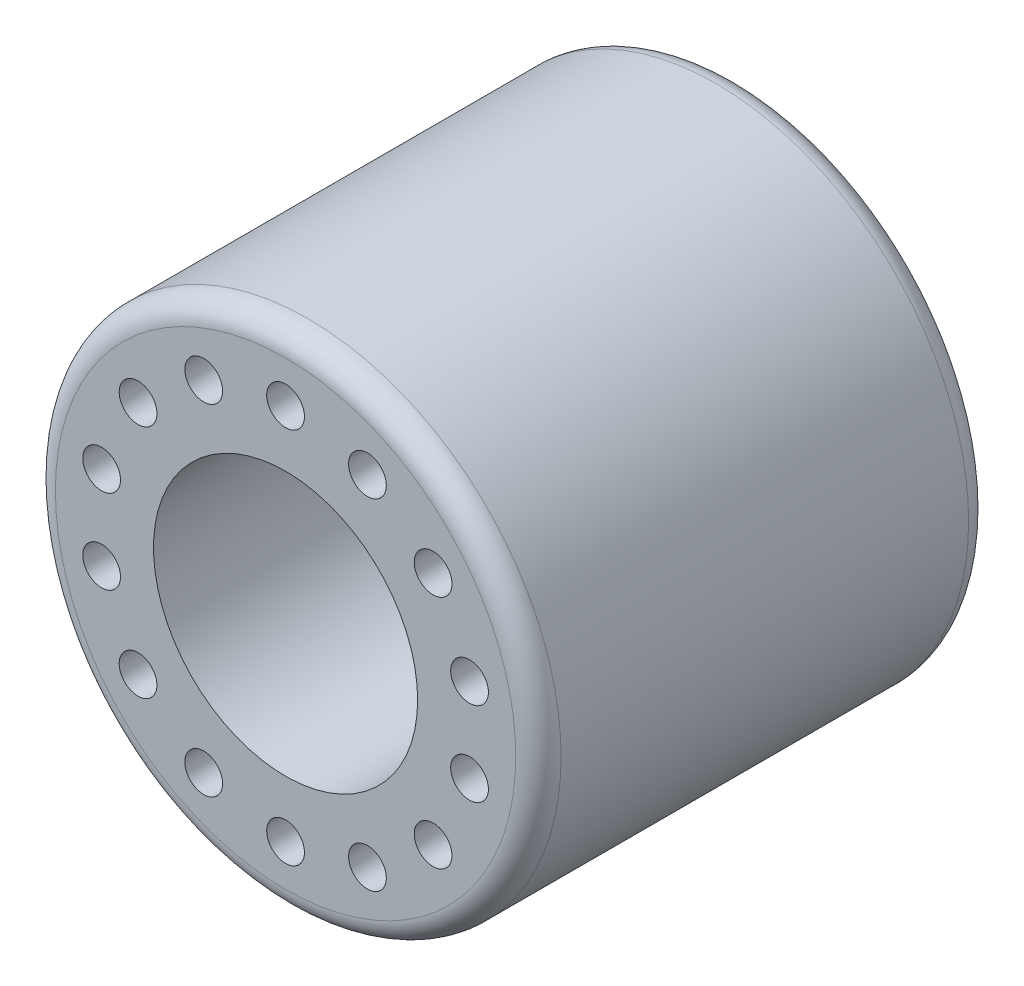
ISO-10303-21;
HEADER;
FILE_DESCRIPTION(('STEP AP214'),'2;1');
FILE_NAME('part.step','',(''),(''),'','','');
FILE_SCHEMA(('AUTOMOTIVE_DESIGN { 1 0 10303 214 1 1 1 1 }'));
ENDSEC;
DATA;
#1=APPLICATION_CONTEXT('core data for automotive mechanical design processes');
#2=APPLICATION_PROTOCOL_DEFINITION('international standard','automotive_design',2000,#1);
#3=PRODUCT_CONTEXT('',#1,'mechanical');
#4=PRODUCT('Part','Part','',(#3));
#5=PRODUCT_RELATED_PRODUCT_CATEGORY('part','',(#4));
#6=PRODUCT_DEFINITION_FORMATION('','',#4);
#7=PRODUCT_DEFINITION_CONTEXT('part definition',#1,'design');
#8=PRODUCT_DEFINITION('design','',#6,#7);
#9=PRODUCT_DEFINITION_SHAPE('','',#8);
#10=(LENGTH_UNIT() NAMED_UNIT(*) SI_UNIT(.MILLI.,.METRE.));
#11=(NAMED_UNIT(*) PLANE_ANGLE_UNIT() SI_UNIT($,.RADIAN.));
#12=(NAMED_UNIT(*) SI_UNIT($,.STERADIAN.) SOLID_ANGLE_UNIT());
#13=UNCERTAINTY_MEASURE_WITH_UNIT(LENGTH_MEASURE(1.E-05),#10,'distance_accuracy_value','');
#14=(GEOMETRIC_REPRESENTATION_CONTEXT(3) GLOBAL_UNCERTAINTY_ASSIGNED_CONTEXT((#13)) GLOBAL_UNIT_ASSIGNED_CONTEXT((#10,
#11,#12)) REPRESENTATION_CONTEXT('',''));
#15=CARTESIAN_POINT('',(0.,0.,0.));
#16=DIRECTION('',(0.,0.,1.));
#17=DIRECTION('',(1.,0.,0.));
#18=AXIS2_PLACEMENT_3D('',#15,#16,#17);
#19=CARTESIAN_POINT('',(0.,0.,15.24));
#20=DIRECTION('',(0.,0.,1.));
#21=DIRECTION('',(1.,0.,0.));
#22=AXIS2_PLACEMENT_3D('',#19,#20,#21);
#23=PLANE('',#22);
#24=CARTESIAN_POINT('',(2.7551617433966,5.72115231118083,15.24));
#25=DIRECTION('',(0.,0.,1.));
#26=DIRECTION('',(1.,0.,0.));
#27=AXIS2_PLACEMENT_3D('',#24,#25,#26);
#28=CIRCLE('',#27,0.634999999999972);
#29=CARTESIAN_POINT('',(3.39016174339657,5.72115231118083,15.24));
#30=VERTEX_POINT('',#29);
#31=EDGE_CURVE('E109',#30,#30,#28,.T.);
#32=ORIENTED_EDGE('',*,*,#31,.F.);
#33=EDGE_LOOP('',(#32));
#34=FACE_BOUND('',#33,.T.);
#35=CARTESIAN_POINT('',(4.9646299136724,3.9591602418038,15.24));
#36=DIRECTION('',(0.,0.,1.));
#37=DIRECTION('',(1.,0.,0.));
#38=AXIS2_PLACEMENT_3D('',#35,#36,#37);
#39=CIRCLE('',#38,0.635000000000155);
#40=CARTESIAN_POINT('',(5.59962991367255,3.9591602418038,15.24));
#41=VERTEX_POINT('',#40);
#42=EDGE_CURVE('E103',#41,#41,#39,.T.);
#43=ORIENTED_EDGE('',*,*,#42,.F.);
#44=EDGE_LOOP('',(#43));
#45=FACE_BOUND('',#44,.T.);
#46=CARTESIAN_POINT('',(6.19079224235542,1.41300793062365,15.24));
#47=DIRECTION('',(0.,0.,1.));
#48=DIRECTION('',(1.,0.,0.));
#49=AXIS2_PLACEMENT_3D('',#46,#47,#48);
#50=CIRCLE('',#49,0.635000000000515);
#51=CARTESIAN_POINT('',(6.82579224235593,1.41300793062365,15.24));
#52=VERTEX_POINT('',#51);
#53=EDGE_CURVE('E97',#52,#52,#50,.T.);
#54=ORIENTED_EDGE('',*,*,#53,.F.);
#55=EDGE_LOOP('',(#54));
#56=FACE_BOUND('',#55,.T.);
#57=CARTESIAN_POINT('',(6.1907922423559,-1.41300793062154,15.24));
#58=DIRECTION('',(0.,0.,1.));
#59=DIRECTION('',(1.,0.,0.));
#60=AXIS2_PLACEMENT_3D('',#57,#58,#59);
#61=CIRCLE('',#60,0.63500000000098);
#62=CARTESIAN_POINT('',(6.82579224235688,-1.41300793062154,15.24));
#63=VERTEX_POINT('',#62);
#64=EDGE_CURVE('E91',#63,#63,#61,.T.);
#65=ORIENTED_EDGE('',*,*,#64,.F.);
#66=EDGE_LOOP('',(#65));
#67=FACE_BOUND('',#66,.T.);
#68=CARTESIAN_POINT('',(4.96462991367375,-3.95916024180211,15.24));
#69=DIRECTION('',(0.,0.,1.));
#70=DIRECTION('',(1.,0.,0.));
#71=AXIS2_PLACEMENT_3D('',#68,#69,#70);
#72=CIRCLE('',#71,0.635000000001461);
#73=CARTESIAN_POINT('',(5.59962991367521,-3.95916024180211,15.24));
#74=VERTEX_POINT('',#73);
#75=EDGE_CURVE('E85',#74,#74,#72,.T.);
#76=ORIENTED_EDGE('',*,*,#75,.F.);
#77=EDGE_LOOP('',(#76));
#78=FACE_BOUND('',#77,.T.);
#79=CARTESIAN_POINT('',(2.75516174339855,-5.72115231117989,15.24));
#80=DIRECTION('',(0.,0.,1.));
#81=DIRECTION('',(1.,0.,0.));
#82=AXIS2_PLACEMENT_3D('',#79,#80,#81);
#83=CIRCLE('',#82,0.635000000001867);
#84=CARTESIAN_POINT('',(3.39016174340042,-5.72115231117989,15.24));
#85=VERTEX_POINT('',#84);
#86=EDGE_CURVE('E79',#85,#85,#83,.T.);
#87=ORIENTED_EDGE('',*,*,#86,.F.);
#88=EDGE_LOOP('',(#87));
#89=FACE_BOUND('',#88,.T.);
#90=CARTESIAN_POINT('',(2.16340130644441E-12,-6.35,15.24));
#91=DIRECTION('',(0.,0.,1.));
#92=DIRECTION('',(1.,0.,0.));
#93=AXIS2_PLACEMENT_3D('',#90,#91,#92);
#94=CIRCLE('',#93,0.635000000002112);
#95=CARTESIAN_POINT('',(0.635000000004275,-6.35,15.24));
#96=VERTEX_POINT('',#95);
#97=EDGE_CURVE('E73',#96,#96,#94,.T.);
#98=ORIENTED_EDGE('',*,*,#97,.F.);
#99=EDGE_LOOP('',(#98));
#100=FACE_BOUND('',#99,.T.);
#101=CARTESIAN_POINT('',(-2.75516174339444,-5.72115231118083,15.24));
#102=DIRECTION('',(0.,0.,1.));
#103=DIRECTION('',(1.,0.,0.));
#104=AXIS2_PLACEMENT_3D('',#101,#102,#103);
#105=CIRCLE('',#104,0.635000000002152);
#106=CARTESIAN_POINT('',(-2.12016174339229,-5.72115231118083,15.24));
#107=VERTEX_POINT('',#106);
#108=EDGE_CURVE('E66',#107,#107,#105,.T.);
#109=ORIENTED_EDGE('',*,*,#108,.F.);
#110=EDGE_LOOP('',(#109));
#111=FACE_BOUND('',#110,.T.);
#112=CARTESIAN_POINT('',(-4.96462991367023,-3.9591602418038,15.24));
#113=DIRECTION('',(0.,0.,1.));
#114=DIRECTION('',(1.,0.,0.));
#115=AXIS2_PLACEMENT_3D('',#112,#113,#114);
#116=CIRCLE('',#115,0.635000000001981);
#117=CARTESIAN_POINT('',(-4.32962991366825,-3.9591602418038,15.24));
#118=VERTEX_POINT('',#117);
#119=EDGE_CURVE('E138',#118,#118,#116,.T.);
#120=ORIENTED_EDGE('',*,*,#119,.F.);
#121=EDGE_LOOP('',(#120));
#122=FACE_BOUND('',#121,.T.);
#123=CARTESIAN_POINT('',(-6.19079224235326,-1.41300793062365,15.24));
#124=DIRECTION('',(0.,0.,1.));
#125=DIRECTION('',(1.,0.,0.));
#126=AXIS2_PLACEMENT_3D('',#123,#124,#125);
#127=CIRCLE('',#126,0.635000000001633);
#128=CARTESIAN_POINT('',(-5.55579224235162,-1.41300793062365,15.24));
#129=VERTEX_POINT('',#128);
#130=EDGE_CURVE('E132',#129,#129,#127,.T.);
#131=ORIENTED_EDGE('',*,*,#130,.F.);
#132=EDGE_LOOP('',(#131));
#133=FACE_BOUND('',#132,.T.);
#134=CARTESIAN_POINT('',(-6.19079224235374,1.41300793062154,15.24));
#135=DIRECTION('',(0.,0.,1.));
#136=DIRECTION('',(1.,0.,0.));
#137=AXIS2_PLACEMENT_3D('',#134,#135,#136);
#138=CIRCLE('',#137,0.635000000001178);
#139=CARTESIAN_POINT('',(-5.55579224235256,1.41300793062154,15.24));
#140=VERTEX_POINT('',#139);
#141=EDGE_CURVE('E126',#140,#140,#138,.T.);
#142=ORIENTED_EDGE('',*,*,#141,.F.);
#143=EDGE_LOOP('',(#142));
#144=FACE_BOUND('',#143,.T.);
#145=CARTESIAN_POINT('',(-4.96462991367158,3.95916024180211,15.24));
#146=DIRECTION('',(0.,0.,1.));
#147=DIRECTION('',(1.,0.,0.));
#148=AXIS2_PLACEMENT_3D('',#145,#146,#147);
#149=CIRCLE('',#148,0.635000000000714);
#150=CARTESIAN_POINT('',(-4.32962991367087,3.95916024180211,15.24));
#151=VERTEX_POINT('',#150);
#152=EDGE_CURVE('E120',#151,#151,#149,.T.);
#153=ORIENTED_EDGE('',*,*,#152,.F.);
#154=EDGE_LOOP('',(#153));
#155=FACE_BOUND('',#154,.T.);
#156=CARTESIAN_POINT('',(-2.75516174339639,5.72115231117989,15.24));
#157=DIRECTION('',(0.,0.,1.));
#158=DIRECTION('',(1.,0.,0.));
#159=AXIS2_PLACEMENT_3D('',#156,#157,#158);
#160=CIRCLE('',#159,0.635000000000322);
#161=CARTESIAN_POINT('',(-2.12016174339607,5.72115231117989,15.24));
#162=VERTEX_POINT('',#161);
#163=EDGE_CURVE('E114',#162,#162,#160,.T.);
#164=ORIENTED_EDGE('',*,*,#163,.F.);
#165=EDGE_LOOP('',(#164));
#166=FACE_BOUND('',#165,.T.);
#167=CARTESIAN_POINT('',(0.,6.35,15.24));
#168=DIRECTION('',(0.,0.,1.));
#169=DIRECTION('',(1.,0.,0.));
#170=AXIS2_PLACEMENT_3D('',#167,#168,#169);
#171=CIRCLE('',#170,0.635);
#172=CARTESIAN_POINT('',(0.635,6.35,15.24));
#173=VERTEX_POINT('',#172);
#174=EDGE_CURVE('E60',#173,#173,#171,.T.);
#175=ORIENTED_EDGE('',*,*,#174,.F.);
#176=EDGE_LOOP('',(#175));
#177=FACE_BOUND('',#176,.T.);
#178=CARTESIAN_POINT('',(0.,0.,15.24));
#179=DIRECTION('',(0.,0.,1.));
#180=DIRECTION('',(1.,0.,0.));
#181=AXIS2_PLACEMENT_3D('',#178,#179,#180);
#182=CIRCLE('',#181,7.747);
#183=CARTESIAN_POINT('',(7.747,0.,15.24));
#184=VERTEX_POINT('',#183);
#185=EDGE_CURVE('E10',#184,#184,#182,.T.);
#186=ORIENTED_EDGE('',*,*,#185,.T.);
#187=EDGE_LOOP('',(#186));
#188=FACE_BOUND('',#187,.T.);
#189=CARTESIAN_POINT('',(0.,0.,15.24));
#190=DIRECTION('',(0.,0.,1.));
#191=DIRECTION('',(1.,0.,0.));
#192=AXIS2_PLACEMENT_3D('',#189,#190,#191);
#193=CIRCLE('',#192,4.445);
#194=CARTESIAN_POINT('',(4.445,0.,15.24));
#195=VERTEX_POINT('',#194);
#196=EDGE_CURVE('E53',#195,#195,#193,.T.);
#197=ORIENTED_EDGE('',*,*,#196,.F.);
#198=EDGE_LOOP('',(#197));
#199=FACE_BOUND('',#198,.T.);
#200=ADVANCED_FACE('F33',(#34,#45,#56,#67,#78,#89,#100,#111,#122,#133,#144,#155,#166,#177,#188,
#199),#23,.T.);
#201=CARTESIAN_POINT('',(0.,0.,0.));
#202=DIRECTION('',(0.,0.,1.));
#203=DIRECTION('',(1.,0.,0.));
#204=AXIS2_PLACEMENT_3D('',#201,#202,#203);
#205=PLANE('',#204);
#206=CARTESIAN_POINT('',(0.,0.,0.));
#207=DIRECTION('',(0.,0.,1.));
#208=DIRECTION('',(1.,0.,0.));
#209=AXIS2_PLACEMENT_3D('',#206,#207,#208);
#210=CIRCLE('',#209,7.747);
#211=CARTESIAN_POINT('',(7.747,0.,0.));
#212=VERTEX_POINT('',#211);
#213=EDGE_CURVE('E40',#212,#212,#210,.F.);
#214=ORIENTED_EDGE('',*,*,#213,.T.);
#215=EDGE_LOOP('',(#214));
#216=FACE_BOUND('',#215,.T.);
#217=CARTESIAN_POINT('',(0.,0.,0.));
#218=DIRECTION('',(0.,0.,1.));
#219=DIRECTION('',(1.,0.,0.));
#220=AXIS2_PLACEMENT_3D('',#217,#218,#219);
#221=CIRCLE('',#220,4.445);
#222=CARTESIAN_POINT('',(4.445,0.,0.));
#223=VERTEX_POINT('',#222);
#224=EDGE_CURVE('E54',#223,#223,#221,.T.);
#225=ORIENTED_EDGE('',*,*,#224,.T.);
#226=EDGE_LOOP('',(#225));
#227=FACE_BOUND('',#226,.T.);
#228=ADVANCED_FACE('F155',(#216,#227),#205,.F.);
#229=CARTESIAN_POINT('',(0.,0.,15.24));
#230=DIRECTION('',(0.,0.,-1.));
#231=DIRECTION('',(-1.,0.,0.));
#232=AXIS2_PLACEMENT_3D('',#229,#230,#231);
#233=CYLINDRICAL_SURFACE('',#232,8.509);
#234=CARTESIAN_POINT('',(0.,0.,0.762000000000001));
#235=DIRECTION('',(0.,0.,1.));
#236=DIRECTION('',(1.,0.,0.));
#237=AXIS2_PLACEMENT_3D('',#234,#235,#236);
#238=CIRCLE('',#237,8.509);
#239=CARTESIAN_POINT('',(8.509,0.,0.762000000000001));
#240=VERTEX_POINT('',#239);
#241=EDGE_CURVE('E44',#240,#240,#238,.T.);
#242=ORIENTED_EDGE('',*,*,#241,.T.);
#243=EDGE_LOOP('',(#242));
#244=FACE_BOUND('',#243,.T.);
#245=CARTESIAN_POINT('',(0.,0.,14.478));
#246=DIRECTION('',(0.,0.,1.));
#247=DIRECTION('',(1.,0.,0.));
#248=AXIS2_PLACEMENT_3D('',#245,#246,#247);
#249=CIRCLE('',#248,8.509);
#250=CARTESIAN_POINT('',(8.509,0.,14.478));
#251=VERTEX_POINT('',#250);
#252=EDGE_CURVE('E48',#251,#251,#249,.F.);
#253=ORIENTED_EDGE('',*,*,#252,.T.);
#254=EDGE_LOOP('',(#253));
#255=FACE_BOUND('',#254,.T.);
#256=ADVANCED_FACE('F174',(#244,#255),#233,.T.);
#257=CARTESIAN_POINT('',(0.,0.,15.24));
#258=DIRECTION('',(0.,0.,-1.));
#259=DIRECTION('',(-1.,0.,0.));
#260=AXIS2_PLACEMENT_3D('',#257,#258,#259);
#261=CYLINDRICAL_SURFACE('',#260,4.445);
#262=ORIENTED_EDGE('',*,*,#196,.T.);
#263=EDGE_LOOP('',(#262));
#264=FACE_BOUND('',#263,.T.);
#265=ORIENTED_EDGE('',*,*,#224,.F.);
#266=EDGE_LOOP('',(#265));
#267=FACE_BOUND('',#266,.T.);
#268=ADVANCED_FACE('F170',(#264,#267),#261,.F.);
#269=CARTESIAN_POINT('',(0.,0.,0.762000000000001));
#270=DIRECTION('',(0.,0.,1.));
#271=DIRECTION('',(1.,0.,0.));
#272=AXIS2_PLACEMENT_3D('',#269,#270,#271);
#273=TOROIDAL_SURFACE('',#272,7.747,0.762);
#274=ORIENTED_EDGE('',*,*,#213,.F.);
#275=EDGE_LOOP('',(#274));
#276=FACE_BOUND('',#275,.T.);
#277=ORIENTED_EDGE('',*,*,#241,.F.);
#278=EDGE_LOOP('',(#277));
#279=FACE_BOUND('',#278,.T.);
#280=ADVANCED_FACE('F173',(#276,#279),#273,.T.);
#281=CARTESIAN_POINT('',(0.,0.,14.478));
#282=DIRECTION('',(0.,0.,1.));
#283=DIRECTION('',(1.,0.,0.));
#284=AXIS2_PLACEMENT_3D('',#281,#282,#283);
#285=TOROIDAL_SURFACE('',#284,7.747,0.762);
#286=ORIENTED_EDGE('',*,*,#252,.F.);
#287=EDGE_LOOP('',(#286));
#288=FACE_BOUND('',#287,.T.);
#289=ORIENTED_EDGE('',*,*,#185,.F.);
#290=EDGE_LOOP('',(#289));
#291=FACE_BOUND('',#290,.T.);
#292=ADVANCED_FACE('F35',(#288,#291),#285,.T.);
#293=CARTESIAN_POINT('',(0.,6.35,13.97));
#294=DIRECTION('',(0.,0.,1.));
#295=DIRECTION('',(1.,0.,0.));
#296=AXIS2_PLACEMENT_3D('',#293,#294,#295);
#297=CYLINDRICAL_SURFACE('',#296,0.635);
#298=CARTESIAN_POINT('',(0.,6.35,13.97));
#299=DIRECTION('',(0.,0.,1.));
#300=DIRECTION('',(1.,0.,0.));
#301=AXIS2_PLACEMENT_3D('',#298,#299,#300);
#302=CIRCLE('',#301,0.635);
#303=CARTESIAN_POINT('',(0.635,6.35,13.97));
#304=VERTEX_POINT('',#303);
#305=EDGE_CURVE('E57',#304,#304,#302,.T.);
#306=ORIENTED_EDGE('',*,*,#305,.F.);
#307=EDGE_LOOP('',(#306));
#308=FACE_BOUND('',#307,.T.);
#309=ORIENTED_EDGE('',*,*,#174,.T.);
#310=EDGE_LOOP('',(#309));
#311=FACE_BOUND('',#310,.T.);
#312=ADVANCED_FACE('F191',(#308,#311),#297,.F.);
#313=CARTESIAN_POINT('',(0.,6.35,13.97));
#314=DIRECTION('',(0.,0.,1.));
#315=DIRECTION('',(1.,0.,0.));
#316=AXIS2_PLACEMENT_3D('',#313,#314,#315);
#317=PLANE('',#316);
#318=ORIENTED_EDGE('',*,*,#305,.T.);
#319=EDGE_LOOP('',(#318));
#320=FACE_BOUND('',#319,.T.);
#321=ADVANCED_FACE('F201',(#320),#317,.T.);
#322=CARTESIAN_POINT('',(-2.75516174339639,5.72115231117989,13.97));
#323=DIRECTION('',(0.,0.,1.));
#324=DIRECTION('',(1.,0.,0.));
#325=AXIS2_PLACEMENT_3D('',#322,#323,#324);
#326=CYLINDRICAL_SURFACE('',#325,0.635000000000322);
#327=CARTESIAN_POINT('',(-2.75516174339639,5.72115231117989,13.97));
#328=DIRECTION('',(0.,0.,1.));
#329=DIRECTION('',(1.,0.,0.));
#330=AXIS2_PLACEMENT_3D('',#327,#328,#329);
#331=CIRCLE('',#330,0.635000000000322);
#332=CARTESIAN_POINT('',(-2.12016174339607,5.72115231117989,13.97));
#333=VERTEX_POINT('',#332);
#334=EDGE_CURVE('E117',#333,#333,#331,.T.);
#335=ORIENTED_EDGE('',*,*,#334,.F.);
#336=EDGE_LOOP('',(#335));
#337=FACE_BOUND('',#336,.T.);
#338=ORIENTED_EDGE('',*,*,#163,.T.);
#339=EDGE_LOOP('',(#338));
#340=FACE_BOUND('',#339,.T.);
#341=ADVANCED_FACE('F207',(#337,#340),#326,.F.);
#342=CARTESIAN_POINT('',(-2.75516174339639,5.72115231117989,13.97));
#343=DIRECTION('',(0.,0.,1.));
#344=DIRECTION('',(1.,0.,0.));
#345=AXIS2_PLACEMENT_3D('',#342,#343,#344);
#346=PLANE('',#345);
#347=ORIENTED_EDGE('',*,*,#334,.T.);
#348=EDGE_LOOP('',(#347));
#349=FACE_BOUND('',#348,.T.);
#350=ADVANCED_FACE('F279',(#349),#346,.T.);
#351=CARTESIAN_POINT('',(-4.96462991367158,3.95916024180211,13.97));
#352=DIRECTION('',(0.,0.,1.));
#353=DIRECTION('',(1.,0.,0.));
#354=AXIS2_PLACEMENT_3D('',#351,#352,#353);
#355=CYLINDRICAL_SURFACE('',#354,0.635000000000714);
#356=CARTESIAN_POINT('',(-4.96462991367158,3.95916024180211,13.97));
#357=DIRECTION('',(0.,0.,1.));
#358=DIRECTION('',(1.,0.,0.));
#359=AXIS2_PLACEMENT_3D('',#356,#357,#358);
#360=CIRCLE('',#359,0.635000000000714);
#361=CARTESIAN_POINT('',(-4.32962991367087,3.95916024180211,13.97));
#362=VERTEX_POINT('',#361);
#363=EDGE_CURVE('E123',#362,#362,#360,.T.);
#364=ORIENTED_EDGE('',*,*,#363,.F.);
#365=EDGE_LOOP('',(#364));
#366=FACE_BOUND('',#365,.T.);
#367=ORIENTED_EDGE('',*,*,#152,.T.);
#368=EDGE_LOOP('',(#367));
#369=FACE_BOUND('',#368,.T.);
#370=ADVANCED_FACE('F283',(#366,#369),#355,.F.);
#371=CARTESIAN_POINT('',(-4.96462991367158,3.95916024180211,13.97));
#372=DIRECTION('',(0.,0.,1.));
#373=DIRECTION('',(1.,0.,0.));
#374=AXIS2_PLACEMENT_3D('',#371,#372,#373);
#375=PLANE('',#374);
#376=ORIENTED_EDGE('',*,*,#363,.T.);
#377=EDGE_LOOP('',(#376));
#378=FACE_BOUND('',#377,.T.);
#379=ADVANCED_FACE('F287',(#378),#375,.T.);
#380=CARTESIAN_POINT('',(-6.19079224235374,1.41300793062154,13.97));
#381=DIRECTION('',(0.,0.,1.));
#382=DIRECTION('',(1.,0.,0.));
#383=AXIS2_PLACEMENT_3D('',#380,#381,#382);
#384=CYLINDRICAL_SURFACE('',#383,0.635000000001178);
#385=CARTESIAN_POINT('',(-6.19079224235374,1.41300793062154,13.97));
#386=DIRECTION('',(0.,0.,1.));
#387=DIRECTION('',(1.,0.,0.));
#388=AXIS2_PLACEMENT_3D('',#385,#386,#387);
#389=CIRCLE('',#388,0.635000000001178);
#390=CARTESIAN_POINT('',(-5.55579224235256,1.41300793062154,13.97));
#391=VERTEX_POINT('',#390);
#392=EDGE_CURVE('E129',#391,#391,#389,.T.);
#393=ORIENTED_EDGE('',*,*,#392,.F.);
#394=EDGE_LOOP('',(#393));
#395=FACE_BOUND('',#394,.T.);
#396=ORIENTED_EDGE('',*,*,#141,.T.);
#397=EDGE_LOOP('',(#396));
#398=FACE_BOUND('',#397,.T.);
#399=ADVANCED_FACE('F291',(#395,#398),#384,.F.);
#400=CARTESIAN_POINT('',(-6.19079224235374,1.41300793062154,13.97));
#401=DIRECTION('',(0.,0.,1.));
#402=DIRECTION('',(1.,0.,0.));
#403=AXIS2_PLACEMENT_3D('',#400,#401,#402);
#404=PLANE('',#403);
#405=ORIENTED_EDGE('',*,*,#392,.T.);
#406=EDGE_LOOP('',(#405));
#407=FACE_BOUND('',#406,.T.);
#408=ADVANCED_FACE('F295',(#407),#404,.T.);
#409=CARTESIAN_POINT('',(-6.19079224235326,-1.41300793062365,13.97));
#410=DIRECTION('',(0.,0.,1.));
#411=DIRECTION('',(1.,0.,0.));
#412=AXIS2_PLACEMENT_3D('',#409,#410,#411);
#413=CYLINDRICAL_SURFACE('',#412,0.635000000001633);
#414=CARTESIAN_POINT('',(-6.19079224235326,-1.41300793062365,13.97));
#415=DIRECTION('',(0.,0.,1.));
#416=DIRECTION('',(1.,0.,0.));
#417=AXIS2_PLACEMENT_3D('',#414,#415,#416);
#418=CIRCLE('',#417,0.635000000001633);
#419=CARTESIAN_POINT('',(-5.55579224235162,-1.41300793062365,13.97));
#420=VERTEX_POINT('',#419);
#421=EDGE_CURVE('E135',#420,#420,#418,.T.);
#422=ORIENTED_EDGE('',*,*,#421,.F.);
#423=EDGE_LOOP('',(#422));
#424=FACE_BOUND('',#423,.T.);
#425=ORIENTED_EDGE('',*,*,#130,.T.);
#426=EDGE_LOOP('',(#425));
#427=FACE_BOUND('',#426,.T.);
#428=ADVANCED_FACE('F299',(#424,#427),#413,.F.);
#429=CARTESIAN_POINT('',(-6.19079224235326,-1.41300793062365,13.97));
#430=DIRECTION('',(0.,0.,1.));
#431=DIRECTION('',(1.,0.,0.));
#432=AXIS2_PLACEMENT_3D('',#429,#430,#431);
#433=PLANE('',#432);
#434=ORIENTED_EDGE('',*,*,#421,.T.);
#435=EDGE_LOOP('',(#434));
#436=FACE_BOUND('',#435,.T.);
#437=ADVANCED_FACE('F149',(#436),#433,.T.);
#438=CARTESIAN_POINT('',(-4.96462991367023,-3.9591602418038,13.97));
#439=DIRECTION('',(0.,0.,1.));
#440=DIRECTION('',(1.,0.,0.));
#441=AXIS2_PLACEMENT_3D('',#438,#439,#440);
#442=CYLINDRICAL_SURFACE('',#441,0.635000000001981);
#443=CARTESIAN_POINT('',(-4.96462991367023,-3.9591602418038,13.97));
#444=DIRECTION('',(0.,0.,1.));
#445=DIRECTION('',(1.,0.,0.));
#446=AXIS2_PLACEMENT_3D('',#443,#444,#445);
#447=CIRCLE('',#446,0.635000000001981);
#448=CARTESIAN_POINT('',(-4.32962991366825,-3.9591602418038,13.97));
#449=VERTEX_POINT('',#448);
#450=EDGE_CURVE('E70',#449,#449,#447,.T.);
#451=ORIENTED_EDGE('',*,*,#450,.F.);
#452=EDGE_LOOP('',(#451));
#453=FACE_BOUND('',#452,.T.);
#454=ORIENTED_EDGE('',*,*,#119,.T.);
#455=EDGE_LOOP('',(#454));
#456=FACE_BOUND('',#455,.T.);
#457=ADVANCED_FACE('F146',(#453,#456),#442,.F.);
#458=CARTESIAN_POINT('',(-4.96462991367023,-3.9591602418038,13.97));
#459=DIRECTION('',(0.,0.,1.));
#460=DIRECTION('',(1.,0.,0.));
#461=AXIS2_PLACEMENT_3D('',#458,#459,#460);
#462=PLANE('',#461);
#463=ORIENTED_EDGE('',*,*,#450,.T.);
#464=EDGE_LOOP('',(#463));
#465=FACE_BOUND('',#464,.T.);
#466=ADVANCED_FACE('F144',(#465),#462,.T.);
#467=CARTESIAN_POINT('',(-2.75516174339444,-5.72115231118083,13.97));
#468=DIRECTION('',(0.,0.,1.));
#469=DIRECTION('',(1.,0.,0.));
#470=AXIS2_PLACEMENT_3D('',#467,#468,#469);
#471=CYLINDRICAL_SURFACE('',#470,0.635000000002152);
#472=CARTESIAN_POINT('',(-2.75516174339444,-5.72115231118083,13.97));
#473=DIRECTION('',(0.,0.,1.));
#474=DIRECTION('',(1.,0.,0.));
#475=AXIS2_PLACEMENT_3D('',#472,#473,#474);
#476=CIRCLE('',#475,0.635000000002152);
#477=CARTESIAN_POINT('',(-2.12016174339229,-5.72115231118083,13.97));
#478=VERTEX_POINT('',#477);
#479=EDGE_CURVE('E69',#478,#478,#476,.T.);
#480=ORIENTED_EDGE('',*,*,#479,.F.);
#481=EDGE_LOOP('',(#480));
#482=FACE_BOUND('',#481,.T.);
#483=ORIENTED_EDGE('',*,*,#108,.T.);
#484=EDGE_LOOP('',(#483));
#485=FACE_BOUND('',#484,.T.);
#486=ADVANCED_FACE('F213',(#482,#485),#471,.F.);
#487=CARTESIAN_POINT('',(-2.75516174339444,-5.72115231118083,13.97));
#488=DIRECTION('',(0.,0.,1.));
#489=DIRECTION('',(1.,0.,0.));
#490=AXIS2_PLACEMENT_3D('',#487,#488,#489);
#491=PLANE('',#490);
#492=ORIENTED_EDGE('',*,*,#479,.T.);
#493=EDGE_LOOP('',(#492));
#494=FACE_BOUND('',#493,.T.);
#495=ADVANCED_FACE('F216',(#494),#491,.T.);
#496=CARTESIAN_POINT('',(2.16340130644441E-12,-6.35,13.97));
#497=DIRECTION('',(0.,0.,1.));
#498=DIRECTION('',(1.,0.,0.));
#499=AXIS2_PLACEMENT_3D('',#496,#497,#498);
#500=CYLINDRICAL_SURFACE('',#499,0.635000000002112);
#501=CARTESIAN_POINT('',(2.16340130644441E-12,-6.35,13.97));
#502=DIRECTION('',(0.,0.,1.));
#503=DIRECTION('',(1.,0.,0.));
#504=AXIS2_PLACEMENT_3D('',#501,#502,#503);
#505=CIRCLE('',#504,0.635000000002112);
#506=CARTESIAN_POINT('',(0.635000000004275,-6.35,13.97));
#507=VERTEX_POINT('',#506);
#508=EDGE_CURVE('E76',#507,#507,#505,.T.);
#509=ORIENTED_EDGE('',*,*,#508,.F.);
#510=EDGE_LOOP('',(#509));
#511=FACE_BOUND('',#510,.T.);
#512=ORIENTED_EDGE('',*,*,#97,.T.);
#513=EDGE_LOOP('',(#512));
#514=FACE_BOUND('',#513,.T.);
#515=ADVANCED_FACE('F220',(#511,#514),#500,.F.);
#516=CARTESIAN_POINT('',(2.16340130644441E-12,-6.35,13.97));
#517=DIRECTION('',(0.,0.,1.));
#518=DIRECTION('',(1.,0.,0.));
#519=AXIS2_PLACEMENT_3D('',#516,#517,#518);
#520=PLANE('',#519);
#521=ORIENTED_EDGE('',*,*,#508,.T.);
#522=EDGE_LOOP('',(#521));
#523=FACE_BOUND('',#522,.T.);
#524=ADVANCED_FACE('F224',(#523),#520,.T.);
#525=CARTESIAN_POINT('',(2.75516174339855,-5.72115231117989,13.97));
#526=DIRECTION('',(0.,0.,1.));
#527=DIRECTION('',(1.,0.,0.));
#528=AXIS2_PLACEMENT_3D('',#525,#526,#527);
#529=CYLINDRICAL_SURFACE('',#528,0.635000000001867);
#530=CARTESIAN_POINT('',(2.75516174339855,-5.72115231117989,13.97));
#531=DIRECTION('',(0.,0.,1.));
#532=DIRECTION('',(1.,0.,0.));
#533=AXIS2_PLACEMENT_3D('',#530,#531,#532);
#534=CIRCLE('',#533,0.635000000001867);
#535=CARTESIAN_POINT('',(3.39016174340042,-5.72115231117989,13.97));
#536=VERTEX_POINT('',#535);
#537=EDGE_CURVE('E82',#536,#536,#534,.T.);
#538=ORIENTED_EDGE('',*,*,#537,.F.);
#539=EDGE_LOOP('',(#538));
#540=FACE_BOUND('',#539,.T.);
#541=ORIENTED_EDGE('',*,*,#86,.T.);
#542=EDGE_LOOP('',(#541));
#543=FACE_BOUND('',#542,.T.);
#544=ADVANCED_FACE('F228',(#540,#543),#529,.F.);
#545=CARTESIAN_POINT('',(2.75516174339855,-5.72115231117989,13.97));
#546=DIRECTION('',(0.,0.,1.));
#547=DIRECTION('',(1.,0.,0.));
#548=AXIS2_PLACEMENT_3D('',#545,#546,#547);
#549=PLANE('',#548);
#550=ORIENTED_EDGE('',*,*,#537,.T.);
#551=EDGE_LOOP('',(#550));
#552=FACE_BOUND('',#551,.T.);
#553=ADVANCED_FACE('F232',(#552),#549,.T.);
#554=CARTESIAN_POINT('',(4.96462991367375,-3.95916024180211,13.97));
#555=DIRECTION('',(0.,0.,1.));
#556=DIRECTION('',(1.,0.,0.));
#557=AXIS2_PLACEMENT_3D('',#554,#555,#556);
#558=CYLINDRICAL_SURFACE('',#557,0.635000000001461);
#559=CARTESIAN_POINT('',(4.96462991367375,-3.95916024180211,13.97));
#560=DIRECTION('',(0.,0.,1.));
#561=DIRECTION('',(1.,0.,0.));
#562=AXIS2_PLACEMENT_3D('',#559,#560,#561);
#563=CIRCLE('',#562,0.635000000001461);
#564=CARTESIAN_POINT('',(5.59962991367521,-3.95916024180211,13.97));
#565=VERTEX_POINT('',#564);
#566=EDGE_CURVE('E88',#565,#565,#563,.T.);
#567=ORIENTED_EDGE('',*,*,#566,.F.);
#568=EDGE_LOOP('',(#567));
#569=FACE_BOUND('',#568,.T.);
#570=ORIENTED_EDGE('',*,*,#75,.T.);
#571=EDGE_LOOP('',(#570));
#572=FACE_BOUND('',#571,.T.);
#573=ADVANCED_FACE('F236',(#569,#572),#558,.F.);
#574=CARTESIAN_POINT('',(4.96462991367375,-3.95916024180211,13.97));
#575=DIRECTION('',(0.,0.,1.));
#576=DIRECTION('',(1.,0.,0.));
#577=AXIS2_PLACEMENT_3D('',#574,#575,#576);
#578=PLANE('',#577);
#579=ORIENTED_EDGE('',*,*,#566,.T.);
#580=EDGE_LOOP('',(#579));
#581=FACE_BOUND('',#580,.T.);
#582=ADVANCED_FACE('F240',(#581),#578,.T.);
#583=CARTESIAN_POINT('',(6.1907922423559,-1.41300793062154,13.97));
#584=DIRECTION('',(0.,0.,1.));
#585=DIRECTION('',(1.,0.,0.));
#586=AXIS2_PLACEMENT_3D('',#583,#584,#585);
#587=CYLINDRICAL_SURFACE('',#586,0.63500000000098);
#588=CARTESIAN_POINT('',(6.1907922423559,-1.41300793062154,13.97));
#589=DIRECTION('',(0.,0.,1.));
#590=DIRECTION('',(1.,0.,0.));
#591=AXIS2_PLACEMENT_3D('',#588,#589,#590);
#592=CIRCLE('',#591,0.63500000000098);
#593=CARTESIAN_POINT('',(6.82579224235688,-1.41300793062154,13.97));
#594=VERTEX_POINT('',#593);
#595=EDGE_CURVE('E94',#594,#594,#592,.T.);
#596=ORIENTED_EDGE('',*,*,#595,.F.);
#597=EDGE_LOOP('',(#596));
#598=FACE_BOUND('',#597,.T.);
#599=ORIENTED_EDGE('',*,*,#64,.T.);
#600=EDGE_LOOP('',(#599));
#601=FACE_BOUND('',#600,.T.);
#602=ADVANCED_FACE('F244',(#598,#601),#587,.F.);
#603=CARTESIAN_POINT('',(6.1907922423559,-1.41300793062154,13.97));
#604=DIRECTION('',(0.,0.,1.));
#605=DIRECTION('',(1.,0.,0.));
#606=AXIS2_PLACEMENT_3D('',#603,#604,#605);
#607=PLANE('',#606);
#608=ORIENTED_EDGE('',*,*,#595,.T.);
#609=EDGE_LOOP('',(#608));
#610=FACE_BOUND('',#609,.T.);
#611=ADVANCED_FACE('F248',(#610),#607,.T.);
#612=CARTESIAN_POINT('',(6.19079224235542,1.41300793062365,13.97));
#613=DIRECTION('',(0.,0.,1.));
#614=DIRECTION('',(1.,0.,0.));
#615=AXIS2_PLACEMENT_3D('',#612,#613,#614);
#616=CYLINDRICAL_SURFACE('',#615,0.635000000000515);
#617=CARTESIAN_POINT('',(6.19079224235542,1.41300793062365,13.97));
#618=DIRECTION('',(0.,0.,1.));
#619=DIRECTION('',(1.,0.,0.));
#620=AXIS2_PLACEMENT_3D('',#617,#618,#619);
#621=CIRCLE('',#620,0.635000000000515);
#622=CARTESIAN_POINT('',(6.82579224235593,1.41300793062365,13.97));
#623=VERTEX_POINT('',#622);
#624=EDGE_CURVE('E100',#623,#623,#621,.T.);
#625=ORIENTED_EDGE('',*,*,#624,.F.);
#626=EDGE_LOOP('',(#625));
#627=FACE_BOUND('',#626,.T.);
#628=ORIENTED_EDGE('',*,*,#53,.T.);
#629=EDGE_LOOP('',(#628));
#630=FACE_BOUND('',#629,.T.);
#631=ADVANCED_FACE('F252',(#627,#630),#616,.F.);
#632=CARTESIAN_POINT('',(6.19079224235542,1.41300793062365,13.97));
#633=DIRECTION('',(0.,0.,1.));
#634=DIRECTION('',(1.,0.,0.));
#635=AXIS2_PLACEMENT_3D('',#632,#633,#634);
#636=PLANE('',#635);
#637=ORIENTED_EDGE('',*,*,#624,.T.);
#638=EDGE_LOOP('',(#637));
#639=FACE_BOUND('',#638,.T.);
#640=ADVANCED_FACE('F256',(#639),#636,.T.);
#641=CARTESIAN_POINT('',(4.9646299136724,3.9591602418038,13.97));
#642=DIRECTION('',(0.,0.,1.));
#643=DIRECTION('',(1.,0.,0.));
#644=AXIS2_PLACEMENT_3D('',#641,#642,#643);
#645=CYLINDRICAL_SURFACE('',#644,0.635000000000155);
#646=CARTESIAN_POINT('',(4.9646299136724,3.9591602418038,13.97));
#647=DIRECTION('',(0.,0.,1.));
#648=DIRECTION('',(1.,0.,0.));
#649=AXIS2_PLACEMENT_3D('',#646,#647,#648);
#650=CIRCLE('',#649,0.635000000000155);
#651=CARTESIAN_POINT('',(5.59962991367255,3.9591602418038,13.97));
#652=VERTEX_POINT('',#651);
#653=EDGE_CURVE('E106',#652,#652,#650,.T.);
#654=ORIENTED_EDGE('',*,*,#653,.F.);
#655=EDGE_LOOP('',(#654));
#656=FACE_BOUND('',#655,.T.);
#657=ORIENTED_EDGE('',*,*,#42,.T.);
#658=EDGE_LOOP('',(#657));
#659=FACE_BOUND('',#658,.T.);
#660=ADVANCED_FACE('F260',(#656,#659),#645,.F.);
#661=CARTESIAN_POINT('',(4.9646299136724,3.9591602418038,13.97));
#662=DIRECTION('',(0.,0.,1.));
#663=DIRECTION('',(1.,0.,0.));
#664=AXIS2_PLACEMENT_3D('',#661,#662,#663);
#665=PLANE('',#664);
#666=ORIENTED_EDGE('',*,*,#653,.T.);
#667=EDGE_LOOP('',(#666));
#668=FACE_BOUND('',#667,.T.);
#669=ADVANCED_FACE('F264',(#668),#665,.T.);
#670=CARTESIAN_POINT('',(2.7551617433966,5.72115231118083,13.97));
#671=DIRECTION('',(0.,0.,1.));
#672=DIRECTION('',(1.,0.,0.));
#673=AXIS2_PLACEMENT_3D('',#670,#671,#672);
#674=CYLINDRICAL_SURFACE('',#673,0.634999999999972);
#675=CARTESIAN_POINT('',(2.7551617433966,5.72115231118083,13.97));
#676=DIRECTION('',(0.,0.,1.));
#677=DIRECTION('',(1.,0.,0.));
#678=AXIS2_PLACEMENT_3D('',#675,#676,#677);
#679=CIRCLE('',#678,0.634999999999972);
#680=CARTESIAN_POINT('',(3.39016174339657,5.72115231118083,13.97));
#681=VERTEX_POINT('',#680);
#682=EDGE_CURVE('E63',#681,#681,#679,.T.);
#683=ORIENTED_EDGE('',*,*,#682,.F.);
#684=EDGE_LOOP('',(#683));
#685=FACE_BOUND('',#684,.T.);
#686=ORIENTED_EDGE('',*,*,#31,.T.);
#687=EDGE_LOOP('',(#686));
#688=FACE_BOUND('',#687,.T.);
#689=ADVANCED_FACE('F268',(#685,#688),#674,.F.);
#690=CARTESIAN_POINT('',(2.7551617433966,5.72115231118083,13.97));
#691=DIRECTION('',(0.,0.,1.));
#692=DIRECTION('',(1.,0.,0.));
#693=AXIS2_PLACEMENT_3D('',#690,#691,#692);
#694=PLANE('',#693);
#695=ORIENTED_EDGE('',*,*,#682,.T.);
#696=EDGE_LOOP('',(#695));
#697=FACE_BOUND('',#696,.T.);
#698=ADVANCED_FACE('F272',(#697),#694,.T.);
#699=CLOSED_SHELL('',(#200,#228,#256,#268,#280,#292,#312,#321,#341,#350,#370,#379,#399,#408,
#428,#437,#457,#466,#486,#495,#515,#524,#544,#553,#573,#582,#602,#611,#631,#640,#660,#669,#689,#698));
#700=MANIFOLD_SOLID_BREP('B2',#699);
#701=ADVANCED_BREP_SHAPE_REPRESENTATION('',(#18,#700),#14);
#702=SHAPE_DEFINITION_REPRESENTATION(#9,#701);
ENDSEC;
END-ISO-10303-21;
